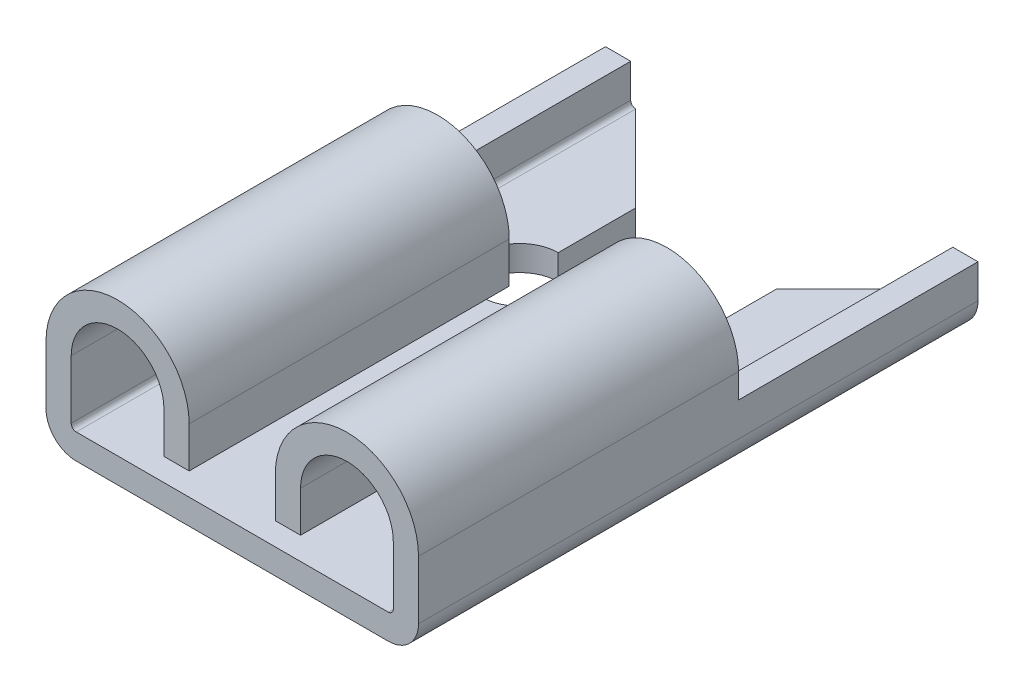
ISO-10303-21;
HEADER;
FILE_DESCRIPTION(('STEP AP214'),'2;1');
FILE_NAME('part.step','',(''),(''),'','','');
FILE_SCHEMA(('AUTOMOTIVE_DESIGN { 1 0 10303 214 1 1 1 1 }'));
ENDSEC;
DATA;
#1=APPLICATION_CONTEXT('core data for automotive mechanical design processes');
#2=APPLICATION_PROTOCOL_DEFINITION('international standard','automotive_design',2000,#1);
#3=PRODUCT_CONTEXT('',#1,'mechanical');
#4=PRODUCT('Part','Part','',(#3));
#5=PRODUCT_RELATED_PRODUCT_CATEGORY('part','',(#4));
#6=PRODUCT_DEFINITION_FORMATION('','',#4);
#7=PRODUCT_DEFINITION_CONTEXT('part definition',#1,'design');
#8=PRODUCT_DEFINITION('design','',#6,#7);
#9=PRODUCT_DEFINITION_SHAPE('','',#8);
#10=(LENGTH_UNIT() NAMED_UNIT(*) SI_UNIT(.MILLI.,.METRE.));
#11=(NAMED_UNIT(*) PLANE_ANGLE_UNIT() SI_UNIT($,.RADIAN.));
#12=(NAMED_UNIT(*) SI_UNIT($,.STERADIAN.) SOLID_ANGLE_UNIT());
#13=UNCERTAINTY_MEASURE_WITH_UNIT(LENGTH_MEASURE(1.E-05),#10,'distance_accuracy_value','');
#14=(GEOMETRIC_REPRESENTATION_CONTEXT(3) GLOBAL_UNCERTAINTY_ASSIGNED_CONTEXT((#13)) GLOBAL_UNIT_ASSIGNED_CONTEXT((#10,
#11,#12)) REPRESENTATION_CONTEXT('',''));
#15=CARTESIAN_POINT('',(0.,0.,0.));
#16=DIRECTION('',(0.,0.,1.));
#17=DIRECTION('',(1.,0.,0.));
#18=AXIS2_PLACEMENT_3D('',#15,#16,#17);
#19=CARTESIAN_POINT('',(-3.095,0.599999999999999,0.));
#20=DIRECTION('',(0.,0.,-1.));
#21=DIRECTION('',(-1.,0.,0.));
#22=AXIS2_PLACEMENT_3D('',#19,#20,#21);
#23=PLANE('',#22);
#24=DIRECTION('',(-1.,0.,0.));
#25=VECTOR('',#24,1.);
#26=CARTESIAN_POINT('',(-3.695,1.27,0.));
#27=LINE('',#26,#25);
#28=CARTESIAN_POINT('',(-3.195,1.27,0.));
#29=VERTEX_POINT('',#28);
#30=CARTESIAN_POINT('',(-3.695,1.27,0.));
#31=VERTEX_POINT('',#30);
#32=EDGE_CURVE('E472',#29,#31,#27,.T.);
#33=ORIENTED_EDGE('',*,*,#32,.F.);
#34=DIRECTION('',(0.,1.,0.));
#35=VECTOR('',#34,1.);
#36=CARTESIAN_POINT('',(-3.195,0.599999999999999,0.));
#37=LINE('',#36,#35);
#38=CARTESIAN_POINT('',(-3.195,0.599999999999999,0.));
#39=VERTEX_POINT('',#38);
#40=EDGE_CURVE('E404',#39,#29,#37,.T.);
#41=ORIENTED_EDGE('',*,*,#40,.F.);
#42=CARTESIAN_POINT('',(-3.095,0.599999999999999,0.));
#43=DIRECTION('',(0.,0.,-1.));
#44=DIRECTION('',(-1.,0.,0.));
#45=AXIS2_PLACEMENT_3D('',#42,#43,#44);
#46=CIRCLE('',#45,0.0999999999999998);
#47=CARTESIAN_POINT('',(-3.095,0.499999999999999,0.));
#48=VERTEX_POINT('',#47);
#49=EDGE_CURVE('E402',#48,#39,#46,.T.);
#50=ORIENTED_EDGE('',*,*,#49,.F.);
#51=DIRECTION('',(0.,-1.,0.));
#52=VECTOR('',#51,1.);
#53=CARTESIAN_POINT('',(-3.095,3.181,0.));
#54=LINE('',#53,#52);
#55=CARTESIAN_POINT('',(-3.095,0.,0.));
#56=VERTEX_POINT('',#55);
#57=EDGE_CURVE('E312',#48,#56,#54,.T.);
#58=ORIENTED_EDGE('',*,*,#57,.T.);
#59=CARTESIAN_POINT('',(-3.095,0.599999999999999,0.));
#60=DIRECTION('',(0.,0.,1.));
#61=DIRECTION('',(-1.,0.,0.));
#62=AXIS2_PLACEMENT_3D('',#59,#60,#61);
#63=CIRCLE('',#62,0.6);
#64=CARTESIAN_POINT('',(-3.695,0.599999999999999,0.));
#65=VERTEX_POINT('',#64);
#66=EDGE_CURVE('E337',#65,#56,#63,.T.);
#67=ORIENTED_EDGE('',*,*,#66,.F.);
#68=DIRECTION('',(0.,-1.,0.));
#69=VECTOR('',#68,1.);
#70=CARTESIAN_POINT('',(-3.695,0.599999999999999,0.));
#71=LINE('',#70,#69);
#72=EDGE_CURVE('E353',#31,#65,#71,.T.);
#73=ORIENTED_EDGE('',*,*,#72,.F.);
#74=EDGE_LOOP('',(#33,#41,#50,#58,#67,#73));
#75=FACE_BOUND('',#74,.T.);
#76=ADVANCED_FACE('F34',(#75),#23,.T.);
#77=CARTESIAN_POINT('',(-3.095,0.599999999999999,11.1));
#78=DIRECTION('',(0.,0.,-1.));
#79=DIRECTION('',(-1.,0.,0.));
#80=AXIS2_PLACEMENT_3D('',#77,#78,#79);
#81=CYLINDRICAL_SURFACE('',#80,0.6);
#82=ORIENTED_EDGE('',*,*,#66,.T.);
#83=DIRECTION('',(0.,0.,-1.));
#84=VECTOR('',#83,1.);
#85=CARTESIAN_POINT('',(-3.095,0.,11.1));
#86=LINE('',#85,#84);
#87=CARTESIAN_POINT('',(-3.095,0.,11.1));
#88=VERTEX_POINT('',#87);
#89=EDGE_CURVE('E11',#88,#56,#86,.T.);
#90=ORIENTED_EDGE('',*,*,#89,.F.);
#91=CARTESIAN_POINT('',(-3.095,0.599999999999999,11.1));
#92=DIRECTION('',(0.,0.,1.));
#93=DIRECTION('',(-1.,0.,0.));
#94=AXIS2_PLACEMENT_3D('',#91,#92,#93);
#95=CIRCLE('',#94,0.6);
#96=CARTESIAN_POINT('',(-3.695,0.599999999999999,11.1));
#97=VERTEX_POINT('',#96);
#98=EDGE_CURVE('E349',#97,#88,#95,.T.);
#99=ORIENTED_EDGE('',*,*,#98,.F.);
#100=DIRECTION('',(0.,0.,-1.));
#101=VECTOR('',#100,1.);
#102=CARTESIAN_POINT('',(-3.695,0.599999999999999,11.1));
#103=LINE('',#102,#101);
#104=EDGE_CURVE('E391',#97,#65,#103,.T.);
#105=ORIENTED_EDGE('',*,*,#104,.T.);
#106=EDGE_LOOP('',(#82,#90,#99,#105));
#107=FACE_BOUND('',#106,.T.);
#108=ADVANCED_FACE('F36',(#107),#81,.T.);
#109=CARTESIAN_POINT('',(0.,0.,11.1));
#110=DIRECTION('',(0.,1.,0.));
#111=DIRECTION('',(-1.,0.,0.));
#112=AXIS2_PLACEMENT_3D('',#109,#110,#111);
#113=PLANE('',#112);
#114=ORIENTED_EDGE('',*,*,#89,.T.);
#115=DIRECTION('',(-0.707106781186549,0.,-0.707106781186546));
#116=VECTOR('',#115,1.);
#117=CARTESIAN_POINT('',(-3.095,0.,0.));
#118=LINE('',#117,#116);
#119=CARTESIAN_POINT('',(-1.395,0.,1.69999999999999));
#120=VERTEX_POINT('',#119);
#121=EDGE_CURVE('E296',#120,#56,#118,.T.);
#122=ORIENTED_EDGE('',*,*,#121,.F.);
#123=DIRECTION('',(0.,0.,-1.));
#124=VECTOR('',#123,1.);
#125=CARTESIAN_POINT('',(-1.395,0.,1.69999999999999));
#126=LINE('',#125,#124);
#127=CARTESIAN_POINT('',(-1.395,0.,3.238));
#128=VERTEX_POINT('',#127);
#129=EDGE_CURVE('E308',#128,#120,#126,.T.);
#130=ORIENTED_EDGE('',*,*,#129,.F.);
#131=CARTESIAN_POINT('',(-1.395,0.,4.));
#132=DIRECTION('',(0.,-1.,0.));
#133=DIRECTION('',(-1.,0.,0.));
#134=AXIS2_PLACEMENT_3D('',#131,#132,#133);
#135=CIRCLE('',#134,0.761999999999999);
#136=CARTESIAN_POINT('',(-0.633000000000001,0.,4.));
#137=VERTEX_POINT('',#136);
#138=EDGE_CURVE('E324',#137,#128,#135,.T.);
#139=ORIENTED_EDGE('',*,*,#138,.F.);
#140=DIRECTION('',(-1.,0.,0.));
#141=VECTOR('',#140,1.);
#142=CARTESIAN_POINT('',(-0.633000000000001,0.,4.));
#143=LINE('',#142,#141);
#144=CARTESIAN_POINT('',(0.632999999999999,0.,4.));
#145=VERTEX_POINT('',#144);
#146=EDGE_CURVE('E327',#145,#137,#143,.T.);
#147=ORIENTED_EDGE('',*,*,#146,.F.);
#148=CARTESIAN_POINT('',(1.395,0.,4.));
#149=DIRECTION('',(0.,-1.,0.));
#150=DIRECTION('',(1.,0.,0.));
#151=AXIS2_PLACEMENT_3D('',#148,#149,#150);
#152=CIRCLE('',#151,0.761999999999999);
#153=CARTESIAN_POINT('',(1.395,0.,3.238));
#154=VERTEX_POINT('',#153);
#155=EDGE_CURVE('E317',#154,#145,#152,.T.);
#156=ORIENTED_EDGE('',*,*,#155,.F.);
#157=DIRECTION('',(0.,0.,1.));
#158=VECTOR('',#157,1.);
#159=CARTESIAN_POINT('',(1.395,0.,1.69999999999999));
#160=LINE('',#159,#158);
#161=CARTESIAN_POINT('',(1.395,0.,1.69999999999999));
#162=VERTEX_POINT('',#161);
#163=EDGE_CURVE('E314',#162,#154,#160,.T.);
#164=ORIENTED_EDGE('',*,*,#163,.F.);
#165=DIRECTION('',(-0.707106781186549,0.,0.707106781186546));
#166=VECTOR('',#165,1.);
#167=CARTESIAN_POINT('',(3.095,0.,0.));
#168=LINE('',#167,#166);
#169=CARTESIAN_POINT('',(3.095,0.,0.));
#170=VERTEX_POINT('',#169);
#171=EDGE_CURVE('E318',#170,#162,#168,.T.);
#172=ORIENTED_EDGE('',*,*,#171,.F.);
#173=DIRECTION('',(0.,0.,-1.));
#174=VECTOR('',#173,1.);
#175=CARTESIAN_POINT('',(3.095,0.,11.1));
#176=LINE('',#175,#174);
#177=CARTESIAN_POINT('',(3.095,0.,11.1));
#178=VERTEX_POINT('',#177);
#179=EDGE_CURVE('E42',#178,#170,#176,.T.);
#180=ORIENTED_EDGE('',*,*,#179,.F.);
#181=DIRECTION('',(1.,0.,0.));
#182=VECTOR('',#181,1.);
#183=CARTESIAN_POINT('',(0.,0.,11.1));
#184=LINE('',#183,#182);
#185=EDGE_CURVE('E352',#88,#178,#184,.T.);
#186=ORIENTED_EDGE('',*,*,#185,.F.);
#187=EDGE_LOOP('',(#114,#122,#130,#139,#147,#156,#164,#172,#180,#186));
#188=FACE_BOUND('',#187,.T.);
#189=ADVANCED_FACE('F525',(#188),#113,.F.);
#190=CARTESIAN_POINT('',(3.095,0.599999999999999,11.1));
#191=DIRECTION('',(0.,0.,-1.));
#192=DIRECTION('',(-1.,0.,0.));
#193=AXIS2_PLACEMENT_3D('',#190,#191,#192);
#194=CYLINDRICAL_SURFACE('',#193,0.6);
#195=CARTESIAN_POINT('',(3.095,0.599999999999999,0.));
#196=DIRECTION('',(0.,0.,1.));
#197=DIRECTION('',(1.,0.,0.));
#198=AXIS2_PLACEMENT_3D('',#195,#196,#197);
#199=CIRCLE('',#198,0.6);
#200=CARTESIAN_POINT('',(3.695,0.599999999999999,0.));
#201=VERTEX_POINT('',#200);
#202=EDGE_CURVE('E394',#170,#201,#199,.T.);
#203=ORIENTED_EDGE('',*,*,#202,.T.);
#204=DIRECTION('',(0.,0.,-1.));
#205=VECTOR('',#204,1.);
#206=CARTESIAN_POINT('',(3.695,0.599999999999999,11.1));
#207=LINE('',#206,#205);
#208=CARTESIAN_POINT('',(3.695,0.599999999999999,11.1));
#209=VERTEX_POINT('',#208);
#210=EDGE_CURVE('E457',#209,#201,#207,.T.);
#211=ORIENTED_EDGE('',*,*,#210,.F.);
#212=CARTESIAN_POINT('',(3.095,0.599999999999999,11.1));
#213=DIRECTION('',(0.,0.,1.));
#214=DIRECTION('',(1.,0.,0.));
#215=AXIS2_PLACEMENT_3D('',#212,#213,#214);
#216=CIRCLE('',#215,0.6);
#217=EDGE_CURVE('E355',#178,#209,#216,.T.);
#218=ORIENTED_EDGE('',*,*,#217,.F.);
#219=ORIENTED_EDGE('',*,*,#179,.T.);
#220=EDGE_LOOP('',(#203,#211,#218,#219));
#221=FACE_BOUND('',#220,.T.);
#222=ADVANCED_FACE('F463',(#221),#194,.T.);
#223=CARTESIAN_POINT('',(3.695,0.599999999999999,11.1));
#224=DIRECTION('',(-1.,0.,0.));
#225=DIRECTION('',(0.,-1.,0.));
#226=AXIS2_PLACEMENT_3D('',#223,#224,#225);
#227=PLANE('',#226);
#228=DIRECTION('',(0.,1.,0.));
#229=VECTOR('',#228,1.);
#230=CARTESIAN_POINT('',(3.695,0.599999999999999,0.));
#231=LINE('',#230,#229);
#232=CARTESIAN_POINT('',(3.695,1.27,0.));
#233=VERTEX_POINT('',#232);
#234=EDGE_CURVE('E253',#201,#233,#231,.T.);
#235=ORIENTED_EDGE('',*,*,#234,.T.);
#236=DIRECTION('',(0.,0.,-1.));
#237=VECTOR('',#236,1.);
#238=CARTESIAN_POINT('',(3.695,1.27,4.75));
#239=LINE('',#238,#237);
#240=CARTESIAN_POINT('',(3.695,1.27,4.75));
#241=VERTEX_POINT('',#240);
#242=EDGE_CURVE('E57',#241,#233,#239,.T.);
#243=ORIENTED_EDGE('',*,*,#242,.F.);
#244=DIRECTION('',(0.,-1.,0.));
#245=VECTOR('',#244,1.);
#246=CARTESIAN_POINT('',(3.695,3.31172477789102,4.75));
#247=LINE('',#246,#245);
#248=CARTESIAN_POINT('',(3.695,1.76,4.75));
#249=VERTEX_POINT('',#248);
#250=EDGE_CURVE('E233',#249,#241,#247,.T.);
#251=ORIENTED_EDGE('',*,*,#250,.F.);
#252=DIRECTION('',(0.,0.,-1.));
#253=VECTOR('',#252,1.);
#254=CARTESIAN_POINT('',(3.695,1.76,11.1));
#255=LINE('',#254,#253);
#256=CARTESIAN_POINT('',(3.695,1.76,11.1));
#257=VERTEX_POINT('',#256);
#258=EDGE_CURVE('E455',#257,#249,#255,.T.);
#259=ORIENTED_EDGE('',*,*,#258,.F.);
#260=DIRECTION('',(0.,1.,0.));
#261=VECTOR('',#260,1.);
#262=CARTESIAN_POINT('',(3.695,0.599999999999999,11.1));
#263=LINE('',#262,#261);
#264=EDGE_CURVE('E357',#209,#257,#263,.T.);
#265=ORIENTED_EDGE('',*,*,#264,.F.);
#266=ORIENTED_EDGE('',*,*,#210,.T.);
#267=EDGE_LOOP('',(#235,#243,#251,#259,#265,#266));
#268=FACE_BOUND('',#267,.T.);
#269=ADVANCED_FACE('F250',(#268),#227,.F.);
#270=CARTESIAN_POINT('',(2.275,1.76,11.1));
#271=DIRECTION('',(0.,0.,-1.));
#272=DIRECTION('',(-1.,0.,0.));
#273=AXIS2_PLACEMENT_3D('',#270,#271,#272);
#274=CYLINDRICAL_SURFACE('',#273,1.42);
#275=ORIENTED_EDGE('',*,*,#258,.T.);
#276=CARTESIAN_POINT('',(2.275,1.76,4.75));
#277=DIRECTION('',(0.,0.,1.));
#278=DIRECTION('',(1.,0.,0.));
#279=AXIS2_PLACEMENT_3D('',#276,#277,#278);
#280=CIRCLE('',#279,1.42);
#281=CARTESIAN_POINT('',(0.855,1.76,4.75));
#282=VERTEX_POINT('',#281);
#283=EDGE_CURVE('E238',#249,#282,#280,.T.);
#284=ORIENTED_EDGE('',*,*,#283,.T.);
#285=DIRECTION('',(0.,0.,-1.));
#286=VECTOR('',#285,1.);
#287=CARTESIAN_POINT('',(0.855,1.76,11.1));
#288=LINE('',#287,#286);
#289=CARTESIAN_POINT('',(0.855,1.76,11.1));
#290=VERTEX_POINT('',#289);
#291=EDGE_CURVE('E452',#290,#282,#288,.T.);
#292=ORIENTED_EDGE('',*,*,#291,.F.);
#293=CARTESIAN_POINT('',(2.275,1.76,11.1));
#294=DIRECTION('',(0.,0.,1.));
#295=DIRECTION('',(-1.,0.,0.));
#296=AXIS2_PLACEMENT_3D('',#293,#294,#295);
#297=CIRCLE('',#296,1.42);
#298=EDGE_CURVE('E359',#257,#290,#297,.T.);
#299=ORIENTED_EDGE('',*,*,#298,.F.);
#300=EDGE_LOOP('',(#275,#284,#292,#299));
#301=FACE_BOUND('',#300,.T.);
#302=ADVANCED_FACE('F713',(#301),#274,.T.);
#303=CARTESIAN_POINT('',(0.855,1.76,11.1));
#304=DIRECTION('',(1.,0.,0.));
#305=DIRECTION('',(0.,1.,0.));
#306=AXIS2_PLACEMENT_3D('',#303,#304,#305);
#307=PLANE('',#306);
#308=ORIENTED_EDGE('',*,*,#291,.T.);
#309=DIRECTION('',(0.,-1.,0.));
#310=VECTOR('',#309,1.);
#311=CARTESIAN_POINT('',(0.855,1.76,4.75));
#312=LINE('',#311,#310);
#313=CARTESIAN_POINT('',(0.855,0.95,4.75));
#314=VERTEX_POINT('',#313);
#315=EDGE_CURVE('E289',#282,#314,#312,.T.);
#316=ORIENTED_EDGE('',*,*,#315,.T.);
#317=DIRECTION('',(0.,0.,-1.));
#318=VECTOR('',#317,1.);
#319=CARTESIAN_POINT('',(0.855,0.95,11.1));
#320=LINE('',#319,#318);
#321=CARTESIAN_POINT('',(0.855,0.95,11.1));
#322=VERTEX_POINT('',#321);
#323=EDGE_CURVE('E449',#322,#314,#320,.T.);
#324=ORIENTED_EDGE('',*,*,#323,.F.);
#325=DIRECTION('',(0.,-1.,0.));
#326=VECTOR('',#325,1.);
#327=CARTESIAN_POINT('',(0.855,1.76,11.1));
#328=LINE('',#327,#326);
#329=EDGE_CURVE('E361',#290,#322,#328,.T.);
#330=ORIENTED_EDGE('',*,*,#329,.F.);
#331=EDGE_LOOP('',(#308,#316,#324,#330));
#332=FACE_BOUND('',#331,.T.);
#333=ADVANCED_FACE('F703',(#332),#307,.F.);
#334=CARTESIAN_POINT('',(1.355,0.95,11.1));
#335=DIRECTION('',(0.,1.,0.));
#336=DIRECTION('',(-1.,0.,0.));
#337=AXIS2_PLACEMENT_3D('',#334,#335,#336);
#338=PLANE('',#337);
#339=ORIENTED_EDGE('',*,*,#323,.T.);
#340=DIRECTION('',(1.,0.,0.));
#341=VECTOR('',#340,1.);
#342=CARTESIAN_POINT('',(1.355,0.95,4.75));
#343=LINE('',#342,#341);
#344=CARTESIAN_POINT('',(1.355,0.95,4.75));
#345=VERTEX_POINT('',#344);
#346=EDGE_CURVE('E286',#314,#345,#343,.T.);
#347=ORIENTED_EDGE('',*,*,#346,.T.);
#348=DIRECTION('',(0.,0.,-1.));
#349=VECTOR('',#348,1.);
#350=CARTESIAN_POINT('',(1.355,0.95,11.1));
#351=LINE('',#350,#349);
#352=CARTESIAN_POINT('',(1.355,0.95,11.1));
#353=VERTEX_POINT('',#352);
#354=EDGE_CURVE('E446',#353,#345,#351,.T.);
#355=ORIENTED_EDGE('',*,*,#354,.F.);
#356=DIRECTION('',(1.,0.,0.));
#357=VECTOR('',#356,1.);
#358=CARTESIAN_POINT('',(1.355,0.95,11.1));
#359=LINE('',#358,#357);
#360=EDGE_CURVE('E363',#322,#353,#359,.T.);
#361=ORIENTED_EDGE('',*,*,#360,.F.);
#362=EDGE_LOOP('',(#339,#347,#355,#361));
#363=FACE_BOUND('',#362,.T.);
#364=ADVANCED_FACE('F693',(#363),#338,.F.);
#365=CARTESIAN_POINT('',(1.355,1.76,11.1));
#366=DIRECTION('',(-1.,0.,0.));
#367=DIRECTION('',(0.,-1.,0.));
#368=AXIS2_PLACEMENT_3D('',#365,#366,#367);
#369=PLANE('',#368);
#370=ORIENTED_EDGE('',*,*,#354,.T.);
#371=DIRECTION('',(0.,1.,0.));
#372=VECTOR('',#371,1.);
#373=CARTESIAN_POINT('',(1.355,1.76,4.75));
#374=LINE('',#373,#372);
#375=CARTESIAN_POINT('',(1.355,1.76,4.75));
#376=VERTEX_POINT('',#375);
#377=EDGE_CURVE('E283',#345,#376,#374,.T.);
#378=ORIENTED_EDGE('',*,*,#377,.T.);
#379=DIRECTION('',(0.,0.,-1.));
#380=VECTOR('',#379,1.);
#381=CARTESIAN_POINT('',(1.355,1.76,11.1));
#382=LINE('',#381,#380);
#383=CARTESIAN_POINT('',(1.355,1.76,11.1));
#384=VERTEX_POINT('',#383);
#385=EDGE_CURVE('E443',#384,#376,#382,.T.);
#386=ORIENTED_EDGE('',*,*,#385,.F.);
#387=DIRECTION('',(0.,1.,0.));
#388=VECTOR('',#387,1.);
#389=CARTESIAN_POINT('',(1.355,1.76,11.1));
#390=LINE('',#389,#388);
#391=EDGE_CURVE('E365',#353,#384,#390,.T.);
#392=ORIENTED_EDGE('',*,*,#391,.F.);
#393=EDGE_LOOP('',(#370,#378,#386,#392));
#394=FACE_BOUND('',#393,.T.);
#395=ADVANCED_FACE('F683',(#394),#369,.F.);
#396=CARTESIAN_POINT('',(2.275,1.76,11.1));
#397=DIRECTION('',(0.,0.,-1.));
#398=DIRECTION('',(-1.,0.,0.));
#399=AXIS2_PLACEMENT_3D('',#396,#397,#398);
#400=CYLINDRICAL_SURFACE('',#399,0.92);
#401=ORIENTED_EDGE('',*,*,#385,.T.);
#402=CARTESIAN_POINT('',(2.275,1.76,4.75));
#403=DIRECTION('',(0.,0.,1.));
#404=DIRECTION('',(1.,0.,0.));
#405=AXIS2_PLACEMENT_3D('',#402,#403,#404);
#406=CIRCLE('',#405,0.92);
#407=CARTESIAN_POINT('',(3.195,1.76,4.75));
#408=VERTEX_POINT('',#407);
#409=EDGE_CURVE('E280',#376,#408,#406,.F.);
#410=ORIENTED_EDGE('',*,*,#409,.T.);
#411=DIRECTION('',(0.,0.,-1.));
#412=VECTOR('',#411,1.);
#413=CARTESIAN_POINT('',(3.195,1.76,11.1));
#414=LINE('',#413,#412);
#415=CARTESIAN_POINT('',(3.195,1.76,11.1));
#416=VERTEX_POINT('',#415);
#417=EDGE_CURVE('E440',#416,#408,#414,.T.);
#418=ORIENTED_EDGE('',*,*,#417,.F.);
#419=CARTESIAN_POINT('',(2.275,1.76,11.1));
#420=DIRECTION('',(0.,0.,-1.));
#421=DIRECTION('',(-1.,0.,0.));
#422=AXIS2_PLACEMENT_3D('',#419,#420,#421);
#423=CIRCLE('',#422,0.92);
#424=EDGE_CURVE('E367',#384,#416,#423,.T.);
#425=ORIENTED_EDGE('',*,*,#424,.F.);
#426=EDGE_LOOP('',(#401,#410,#418,#425));
#427=FACE_BOUND('',#426,.T.);
#428=ADVANCED_FACE('F671',(#427),#400,.F.);
#429=CARTESIAN_POINT('',(3.195,0.599999999999999,11.1));
#430=DIRECTION('',(1.,0.,0.));
#431=DIRECTION('',(0.,0.,-1.));
#432=AXIS2_PLACEMENT_3D('',#429,#430,#431);
#433=PLANE('',#432);
#434=DIRECTION('',(0.,-1.,0.));
#435=VECTOR('',#434,1.);
#436=CARTESIAN_POINT('',(3.195,0.599999999999999,4.75));
#437=LINE('',#436,#435);
#438=CARTESIAN_POINT('',(3.195,1.27,4.75));
#439=VERTEX_POINT('',#438);
#440=EDGE_CURVE('E278',#408,#439,#437,.T.);
#441=ORIENTED_EDGE('',*,*,#440,.T.);
#442=DIRECTION('',(0.,0.,-1.));
#443=VECTOR('',#442,1.);
#444=CARTESIAN_POINT('',(3.195,1.27,11.1));
#445=LINE('',#444,#443);
#446=CARTESIAN_POINT('',(3.195,1.27,0.));
#447=VERTEX_POINT('',#446);
#448=EDGE_CURVE('E246',#439,#447,#445,.T.);
#449=ORIENTED_EDGE('',*,*,#448,.T.);
#450=DIRECTION('',(0.,-1.,0.));
#451=VECTOR('',#450,1.);
#452=CARTESIAN_POINT('',(3.195,0.599999999999999,0.));
#453=LINE('',#452,#451);
#454=CARTESIAN_POINT('',(3.195,0.599999999999999,0.));
#455=VERTEX_POINT('',#454);
#456=EDGE_CURVE('E397',#447,#455,#453,.T.);
#457=ORIENTED_EDGE('',*,*,#456,.T.);
#458=DIRECTION('',(0.,0.,-1.));
#459=VECTOR('',#458,1.);
#460=CARTESIAN_POINT('',(3.195,0.599999999999999,11.1));
#461=LINE('',#460,#459);
#462=CARTESIAN_POINT('',(3.195,0.599999999999999,11.1));
#463=VERTEX_POINT('',#462);
#464=EDGE_CURVE('E437',#463,#455,#461,.T.);
#465=ORIENTED_EDGE('',*,*,#464,.F.);
#466=DIRECTION('',(0.,-1.,0.));
#467=VECTOR('',#466,1.);
#468=CARTESIAN_POINT('',(3.195,0.599999999999999,11.1));
#469=LINE('',#468,#467);
#470=EDGE_CURVE('E369',#416,#463,#469,.T.);
#471=ORIENTED_EDGE('',*,*,#470,.F.);
#472=ORIENTED_EDGE('',*,*,#417,.T.);
#473=EDGE_LOOP('',(#441,#449,#457,#465,#471,#472));
#474=FACE_BOUND('',#473,.T.);
#475=ADVANCED_FACE('F665',(#474),#433,.F.);
#476=CARTESIAN_POINT('',(3.095,0.599999999999999,11.1));
#477=DIRECTION('',(0.,0.,-1.));
#478=DIRECTION('',(-1.,0.,0.));
#479=AXIS2_PLACEMENT_3D('',#476,#477,#478);
#480=CYLINDRICAL_SURFACE('',#479,0.0999999999999998);
#481=CARTESIAN_POINT('',(3.095,0.599999999999999,0.));
#482=DIRECTION('',(0.,0.,-1.));
#483=DIRECTION('',(1.,0.,0.));
#484=AXIS2_PLACEMENT_3D('',#481,#482,#483);
#485=CIRCLE('',#484,0.0999999999999998);
#486=CARTESIAN_POINT('',(3.095,0.499999999999999,0.));
#487=VERTEX_POINT('',#486);
#488=EDGE_CURVE('E399',#455,#487,#485,.T.);
#489=ORIENTED_EDGE('',*,*,#488,.T.);
#490=DIRECTION('',(0.,0.,-1.));
#491=VECTOR('',#490,1.);
#492=CARTESIAN_POINT('',(3.095,0.499999999999999,11.1));
#493=LINE('',#492,#491);
#494=CARTESIAN_POINT('',(3.095,0.499999999999999,11.1));
#495=VERTEX_POINT('',#494);
#496=EDGE_CURVE('E434',#495,#487,#493,.T.);
#497=ORIENTED_EDGE('',*,*,#496,.F.);
#498=CARTESIAN_POINT('',(3.095,0.599999999999999,11.1));
#499=DIRECTION('',(0.,0.,-1.));
#500=DIRECTION('',(1.,0.,0.));
#501=AXIS2_PLACEMENT_3D('',#498,#499,#500);
#502=CIRCLE('',#501,0.0999999999999998);
#503=EDGE_CURVE('E371',#463,#495,#502,.T.);
#504=ORIENTED_EDGE('',*,*,#503,.F.);
#505=ORIENTED_EDGE('',*,*,#464,.T.);
#506=EDGE_LOOP('',(#489,#497,#504,#505));
#507=FACE_BOUND('',#506,.T.);
#508=ADVANCED_FACE('F670',(#507),#480,.F.);
#509=CARTESIAN_POINT('',(0.,0.5,11.1));
#510=DIRECTION('',(0.,-1.,0.));
#511=DIRECTION('',(1.,0.,0.));
#512=AXIS2_PLACEMENT_3D('',#509,#510,#511);
#513=PLANE('',#512);
#514=DIRECTION('',(0.,0.,1.));
#515=VECTOR('',#514,1.);
#516=CARTESIAN_POINT('',(-1.395,0.5,1.69999999999999));
#517=LINE('',#516,#515);
#518=CARTESIAN_POINT('',(-1.395,0.5,1.69999999999999));
#519=VERTEX_POINT('',#518);
#520=CARTESIAN_POINT('',(-1.395,0.5,3.238));
#521=VERTEX_POINT('',#520);
#522=EDGE_CURVE('E339',#519,#521,#517,.T.);
#523=ORIENTED_EDGE('',*,*,#522,.F.);
#524=DIRECTION('',(0.707106781186549,0.,0.707106781186546));
#525=VECTOR('',#524,1.);
#526=CARTESIAN_POINT('',(-3.095,0.499999999999999,0.));
#527=LINE('',#526,#525);
#528=EDGE_CURVE('E334',#48,#519,#527,.T.);
#529=ORIENTED_EDGE('',*,*,#528,.F.);
#530=DIRECTION('',(0.,0.,-1.));
#531=VECTOR('',#530,1.);
#532=CARTESIAN_POINT('',(-3.095,0.499999999999999,11.1));
#533=LINE('',#532,#531);
#534=CARTESIAN_POINT('',(-3.095,0.499999999999999,11.1));
#535=VERTEX_POINT('',#534);
#536=EDGE_CURVE('E431',#535,#48,#533,.T.);
#537=ORIENTED_EDGE('',*,*,#536,.F.);
#538=DIRECTION('',(-1.,0.,0.));
#539=VECTOR('',#538,1.);
#540=CARTESIAN_POINT('',(0.,0.5,11.1));
#541=LINE('',#540,#539);
#542=EDGE_CURVE('E373',#495,#535,#541,.T.);
#543=ORIENTED_EDGE('',*,*,#542,.F.);
#544=ORIENTED_EDGE('',*,*,#496,.T.);
#545=DIRECTION('',(0.707106781186549,0.,-0.707106781186546));
#546=VECTOR('',#545,1.);
#547=CARTESIAN_POINT('',(3.095,0.500000000000001,0.));
#548=LINE('',#547,#546);
#549=CARTESIAN_POINT('',(1.395,0.5,1.69999999999999));
#550=VERTEX_POINT('',#549);
#551=EDGE_CURVE('E332',#550,#487,#548,.T.);
#552=ORIENTED_EDGE('',*,*,#551,.F.);
#553=DIRECTION('',(0.,0.,-1.));
#554=VECTOR('',#553,1.);
#555=CARTESIAN_POINT('',(1.395,0.5,1.69999999999999));
#556=LINE('',#555,#554);
#557=CARTESIAN_POINT('',(1.395,0.5,3.238));
#558=VERTEX_POINT('',#557);
#559=EDGE_CURVE('E303',#558,#550,#556,.T.);
#560=ORIENTED_EDGE('',*,*,#559,.F.);
#561=CARTESIAN_POINT('',(1.395,0.5,4.));
#562=DIRECTION('',(0.,-1.,0.));
#563=DIRECTION('',(1.,0.,0.));
#564=AXIS2_PLACEMENT_3D('',#561,#562,#563);
#565=CIRCLE('',#564,0.761999999999999);
#566=CARTESIAN_POINT('',(0.632999999999999,0.5,4.));
#567=VERTEX_POINT('',#566);
#568=EDGE_CURVE('E299',#567,#558,#565,.F.);
#569=ORIENTED_EDGE('',*,*,#568,.F.);
#570=DIRECTION('',(1.,0.,0.));
#571=VECTOR('',#570,1.);
#572=CARTESIAN_POINT('',(-0.633,0.5,4.));
#573=LINE('',#572,#571);
#574=CARTESIAN_POINT('',(-0.633000000000001,0.5,4.));
#575=VERTEX_POINT('',#574);
#576=EDGE_CURVE('E297',#575,#567,#573,.T.);
#577=ORIENTED_EDGE('',*,*,#576,.F.);
#578=CARTESIAN_POINT('',(-1.395,0.5,4.));
#579=DIRECTION('',(0.,-1.,0.));
#580=DIRECTION('',(1.,0.,0.));
#581=AXIS2_PLACEMENT_3D('',#578,#579,#580);
#582=CIRCLE('',#581,0.761999999999999);
#583=EDGE_CURVE('E300',#521,#575,#582,.F.);
#584=ORIENTED_EDGE('',*,*,#583,.F.);
#585=EDGE_LOOP('',(#523,#529,#537,#543,#544,#552,#560,#569,#577,#584));
#586=FACE_BOUND('',#585,.T.);
#587=ADVANCED_FACE('F784',(#586),#513,.F.);
#588=CARTESIAN_POINT('',(-3.095,0.599999999999999,11.1));
#589=DIRECTION('',(0.,0.,-1.));
#590=DIRECTION('',(-1.,0.,0.));
#591=AXIS2_PLACEMENT_3D('',#588,#589,#590);
#592=CYLINDRICAL_SURFACE('',#591,0.0999999999999998);
#593=ORIENTED_EDGE('',*,*,#49,.T.);
#594=DIRECTION('',(0.,0.,-1.));
#595=VECTOR('',#594,1.);
#596=CARTESIAN_POINT('',(-3.195,0.599999999999999,11.1));
#597=LINE('',#596,#595);
#598=CARTESIAN_POINT('',(-3.195,0.599999999999999,11.1));
#599=VERTEX_POINT('',#598);
#600=EDGE_CURVE('E428',#599,#39,#597,.T.);
#601=ORIENTED_EDGE('',*,*,#600,.F.);
#602=CARTESIAN_POINT('',(-3.095,0.599999999999999,11.1));
#603=DIRECTION('',(0.,0.,-1.));
#604=DIRECTION('',(-1.,0.,0.));
#605=AXIS2_PLACEMENT_3D('',#602,#603,#604);
#606=CIRCLE('',#605,0.0999999999999998);
#607=EDGE_CURVE('E375',#535,#599,#606,.T.);
#608=ORIENTED_EDGE('',*,*,#607,.F.);
#609=ORIENTED_EDGE('',*,*,#536,.T.);
#610=EDGE_LOOP('',(#593,#601,#608,#609));
#611=FACE_BOUND('',#610,.T.);
#612=ADVANCED_FACE('F520',(#611),#592,.F.);
#613=CARTESIAN_POINT('',(-3.195,0.599999999999999,11.1));
#614=DIRECTION('',(-1.,0.,0.));
#615=DIRECTION('',(0.,0.,1.));
#616=AXIS2_PLACEMENT_3D('',#613,#614,#615);
#617=PLANE('',#616);
#618=ORIENTED_EDGE('',*,*,#40,.T.);
#619=DIRECTION('',(0.,0.,1.));
#620=VECTOR('',#619,1.);
#621=CARTESIAN_POINT('',(-3.195,1.27,11.1));
#622=LINE('',#621,#620);
#623=CARTESIAN_POINT('',(-3.195,1.27,4.75));
#624=VERTEX_POINT('',#623);
#625=EDGE_CURVE('E293',#29,#624,#622,.T.);
#626=ORIENTED_EDGE('',*,*,#625,.T.);
#627=DIRECTION('',(0.,1.,0.));
#628=VECTOR('',#627,1.);
#629=CARTESIAN_POINT('',(-3.195,0.599999999999999,4.75));
#630=LINE('',#629,#628);
#631=CARTESIAN_POINT('',(-3.195,1.76,4.75));
#632=VERTEX_POINT('',#631);
#633=EDGE_CURVE('E275',#624,#632,#630,.T.);
#634=ORIENTED_EDGE('',*,*,#633,.T.);
#635=DIRECTION('',(0.,0.,-1.));
#636=VECTOR('',#635,1.);
#637=CARTESIAN_POINT('',(-3.195,1.76,11.1));
#638=LINE('',#637,#636);
#639=CARTESIAN_POINT('',(-3.195,1.76,11.1));
#640=VERTEX_POINT('',#639);
#641=EDGE_CURVE('E425',#640,#632,#638,.T.);
#642=ORIENTED_EDGE('',*,*,#641,.F.);
#643=DIRECTION('',(0.,1.,0.));
#644=VECTOR('',#643,1.);
#645=CARTESIAN_POINT('',(-3.195,0.599999999999999,11.1));
#646=LINE('',#645,#644);
#647=EDGE_CURVE('E377',#599,#640,#646,.T.);
#648=ORIENTED_EDGE('',*,*,#647,.F.);
#649=ORIENTED_EDGE('',*,*,#600,.T.);
#650=EDGE_LOOP('',(#618,#626,#634,#642,#648,#649));
#651=FACE_BOUND('',#650,.T.);
#652=ADVANCED_FACE('F509',(#651),#617,.F.);
#653=CARTESIAN_POINT('',(-2.275,1.76,11.1));
#654=DIRECTION('',(0.,0.,-1.));
#655=DIRECTION('',(-1.,0.,0.));
#656=AXIS2_PLACEMENT_3D('',#653,#654,#655);
#657=CYLINDRICAL_SURFACE('',#656,0.92);
#658=ORIENTED_EDGE('',*,*,#641,.T.);
#659=CARTESIAN_POINT('',(-2.275,1.76,4.75));
#660=DIRECTION('',(0.,0.,1.));
#661=DIRECTION('',(1.,0.,0.));
#662=AXIS2_PLACEMENT_3D('',#659,#660,#661);
#663=CIRCLE('',#662,0.92);
#664=CARTESIAN_POINT('',(-1.355,1.76,4.75));
#665=VERTEX_POINT('',#664);
#666=EDGE_CURVE('E272',#632,#665,#663,.F.);
#667=ORIENTED_EDGE('',*,*,#666,.T.);
#668=DIRECTION('',(0.,0.,-1.));
#669=VECTOR('',#668,1.);
#670=CARTESIAN_POINT('',(-1.355,1.76,11.1));
#671=LINE('',#670,#669);
#672=CARTESIAN_POINT('',(-1.355,1.76,11.1));
#673=VERTEX_POINT('',#672);
#674=EDGE_CURVE('E422',#673,#665,#671,.T.);
#675=ORIENTED_EDGE('',*,*,#674,.F.);
#676=CARTESIAN_POINT('',(-2.275,1.76,11.1));
#677=DIRECTION('',(0.,0.,-1.));
#678=DIRECTION('',(1.,0.,0.));
#679=AXIS2_PLACEMENT_3D('',#676,#677,#678);
#680=CIRCLE('',#679,0.92);
#681=EDGE_CURVE('E379',#640,#673,#680,.T.);
#682=ORIENTED_EDGE('',*,*,#681,.F.);
#683=EDGE_LOOP('',(#658,#667,#675,#682));
#684=FACE_BOUND('',#683,.T.);
#685=ADVANCED_FACE('F504',(#684),#657,.F.);
#686=CARTESIAN_POINT('',(-1.355,1.76,11.1));
#687=DIRECTION('',(1.,0.,0.));
#688=DIRECTION('',(0.,0.,-1.));
#689=AXIS2_PLACEMENT_3D('',#686,#687,#688);
#690=PLANE('',#689);
#691=ORIENTED_EDGE('',*,*,#674,.T.);
#692=DIRECTION('',(0.,-1.,0.));
#693=VECTOR('',#692,1.);
#694=CARTESIAN_POINT('',(-1.355,1.76,4.75));
#695=LINE('',#694,#693);
#696=CARTESIAN_POINT('',(-1.355,0.95,4.75));
#697=VERTEX_POINT('',#696);
#698=EDGE_CURVE('E269',#665,#697,#695,.T.);
#699=ORIENTED_EDGE('',*,*,#698,.T.);
#700=DIRECTION('',(0.,0.,-1.));
#701=VECTOR('',#700,1.);
#702=CARTESIAN_POINT('',(-1.355,0.95,11.1));
#703=LINE('',#702,#701);
#704=CARTESIAN_POINT('',(-1.355,0.95,11.1));
#705=VERTEX_POINT('',#704);
#706=EDGE_CURVE('E419',#705,#697,#703,.T.);
#707=ORIENTED_EDGE('',*,*,#706,.F.);
#708=DIRECTION('',(0.,-1.,0.));
#709=VECTOR('',#708,1.);
#710=CARTESIAN_POINT('',(-1.355,1.76,11.1));
#711=LINE('',#710,#709);
#712=EDGE_CURVE('E381',#673,#705,#711,.T.);
#713=ORIENTED_EDGE('',*,*,#712,.F.);
#714=EDGE_LOOP('',(#691,#699,#707,#713));
#715=FACE_BOUND('',#714,.T.);
#716=ADVANCED_FACE('F501',(#715),#690,.F.);
#717=CARTESIAN_POINT('',(-1.355,0.95,11.1));
#718=DIRECTION('',(0.,1.,0.));
#719=DIRECTION('',(-1.,0.,0.));
#720=AXIS2_PLACEMENT_3D('',#717,#718,#719);
#721=PLANE('',#720);
#722=ORIENTED_EDGE('',*,*,#706,.T.);
#723=DIRECTION('',(1.,0.,0.));
#724=VECTOR('',#723,1.);
#725=CARTESIAN_POINT('',(-1.355,0.95,4.75));
#726=LINE('',#725,#724);
#727=CARTESIAN_POINT('',(-0.855,0.95,4.75));
#728=VERTEX_POINT('',#727);
#729=EDGE_CURVE('E266',#697,#728,#726,.T.);
#730=ORIENTED_EDGE('',*,*,#729,.T.);
#731=DIRECTION('',(0.,0.,-1.));
#732=VECTOR('',#731,1.);
#733=CARTESIAN_POINT('',(-0.855,0.95,11.1));
#734=LINE('',#733,#732);
#735=CARTESIAN_POINT('',(-0.855,0.95,11.1));
#736=VERTEX_POINT('',#735);
#737=EDGE_CURVE('E416',#736,#728,#734,.T.);
#738=ORIENTED_EDGE('',*,*,#737,.F.);
#739=DIRECTION('',(1.,0.,0.));
#740=VECTOR('',#739,1.);
#741=CARTESIAN_POINT('',(-1.355,0.95,11.1));
#742=LINE('',#741,#740);
#743=EDGE_CURVE('E383',#705,#736,#742,.T.);
#744=ORIENTED_EDGE('',*,*,#743,.F.);
#745=EDGE_LOOP('',(#722,#730,#738,#744));
#746=FACE_BOUND('',#745,.T.);
#747=ADVANCED_FACE('F497',(#746),#721,.F.);
#748=CARTESIAN_POINT('',(-0.855,1.76,11.1));
#749=DIRECTION('',(-1.,0.,0.));
#750=DIRECTION('',(0.,-1.,0.));
#751=AXIS2_PLACEMENT_3D('',#748,#749,#750);
#752=PLANE('',#751);
#753=ORIENTED_EDGE('',*,*,#737,.T.);
#754=DIRECTION('',(0.,1.,0.));
#755=VECTOR('',#754,1.);
#756=CARTESIAN_POINT('',(-0.855,1.76,4.75));
#757=LINE('',#756,#755);
#758=CARTESIAN_POINT('',(-0.855,1.76,4.75));
#759=VERTEX_POINT('',#758);
#760=EDGE_CURVE('E263',#728,#759,#757,.T.);
#761=ORIENTED_EDGE('',*,*,#760,.T.);
#762=DIRECTION('',(0.,0.,-1.));
#763=VECTOR('',#762,1.);
#764=CARTESIAN_POINT('',(-0.855,1.76,11.1));
#765=LINE('',#764,#763);
#766=CARTESIAN_POINT('',(-0.855,1.76,11.1));
#767=VERTEX_POINT('',#766);
#768=EDGE_CURVE('E413',#767,#759,#765,.T.);
#769=ORIENTED_EDGE('',*,*,#768,.F.);
#770=DIRECTION('',(0.,1.,0.));
#771=VECTOR('',#770,1.);
#772=CARTESIAN_POINT('',(-0.855,1.76,11.1));
#773=LINE('',#772,#771);
#774=EDGE_CURVE('E385',#736,#767,#773,.T.);
#775=ORIENTED_EDGE('',*,*,#774,.F.);
#776=EDGE_LOOP('',(#753,#761,#769,#775));
#777=FACE_BOUND('',#776,.T.);
#778=ADVANCED_FACE('F495',(#777),#752,.F.);
#779=CARTESIAN_POINT('',(-2.275,1.76,11.1));
#780=DIRECTION('',(0.,0.,-1.));
#781=DIRECTION('',(-1.,0.,0.));
#782=AXIS2_PLACEMENT_3D('',#779,#780,#781);
#783=CYLINDRICAL_SURFACE('',#782,1.42);
#784=ORIENTED_EDGE('',*,*,#768,.T.);
#785=CARTESIAN_POINT('',(-2.275,1.76,4.75));
#786=DIRECTION('',(0.,0.,1.));
#787=DIRECTION('',(1.,0.,0.));
#788=AXIS2_PLACEMENT_3D('',#785,#786,#787);
#789=CIRCLE('',#788,1.42);
#790=CARTESIAN_POINT('',(-3.695,1.76,4.75));
#791=VERTEX_POINT('',#790);
#792=EDGE_CURVE('E260',#759,#791,#789,.T.);
#793=ORIENTED_EDGE('',*,*,#792,.T.);
#794=DIRECTION('',(0.,0.,-1.));
#795=VECTOR('',#794,1.);
#796=CARTESIAN_POINT('',(-3.695,1.76,11.1));
#797=LINE('',#796,#795);
#798=CARTESIAN_POINT('',(-3.695,1.76,11.1));
#799=VERTEX_POINT('',#798);
#800=EDGE_CURVE('E410',#799,#791,#797,.T.);
#801=ORIENTED_EDGE('',*,*,#800,.F.);
#802=CARTESIAN_POINT('',(-2.275,1.76,11.1));
#803=DIRECTION('',(0.,0.,1.));
#804=DIRECTION('',(1.,0.,0.));
#805=AXIS2_PLACEMENT_3D('',#802,#803,#804);
#806=CIRCLE('',#805,1.42);
#807=EDGE_CURVE('E387',#767,#799,#806,.T.);
#808=ORIENTED_EDGE('',*,*,#807,.F.);
#809=EDGE_LOOP('',(#784,#793,#801,#808));
#810=FACE_BOUND('',#809,.T.);
#811=ADVANCED_FACE('F481',(#810),#783,.T.);
#812=CARTESIAN_POINT('',(-3.695,0.599999999999999,11.1));
#813=DIRECTION('',(1.,0.,0.));
#814=DIRECTION('',(0.,1.,0.));
#815=AXIS2_PLACEMENT_3D('',#812,#813,#814);
#816=PLANE('',#815);
#817=DIRECTION('',(0.,1.,0.));
#818=VECTOR('',#817,1.);
#819=CARTESIAN_POINT('',(-3.695,3.31172477789102,4.75));
#820=LINE('',#819,#818);
#821=CARTESIAN_POINT('',(-3.695,1.27,4.75));
#822=VERTEX_POINT('',#821);
#823=EDGE_CURVE('E242',#822,#791,#820,.T.);
#824=ORIENTED_EDGE('',*,*,#823,.F.);
#825=DIRECTION('',(0.,0.,-1.));
#826=VECTOR('',#825,1.);
#827=CARTESIAN_POINT('',(-3.695,1.27,4.75));
#828=LINE('',#827,#826);
#829=EDGE_CURVE('E49',#822,#31,#828,.T.);
#830=ORIENTED_EDGE('',*,*,#829,.T.);
#831=ORIENTED_EDGE('',*,*,#72,.T.);
#832=ORIENTED_EDGE('',*,*,#104,.F.);
#833=DIRECTION('',(0.,-1.,0.));
#834=VECTOR('',#833,1.);
#835=CARTESIAN_POINT('',(-3.695,0.599999999999999,11.1));
#836=LINE('',#835,#834);
#837=EDGE_CURVE('E389',#799,#97,#836,.T.);
#838=ORIENTED_EDGE('',*,*,#837,.F.);
#839=ORIENTED_EDGE('',*,*,#800,.T.);
#840=EDGE_LOOP('',(#824,#830,#831,#832,#838,#839));
#841=FACE_BOUND('',#840,.T.);
#842=ADVANCED_FACE('F485',(#841),#816,.F.);
#843=CARTESIAN_POINT('',(-3.095,0.599999999999999,11.1));
#844=DIRECTION('',(0.,0.,-1.));
#845=DIRECTION('',(-1.,0.,0.));
#846=AXIS2_PLACEMENT_3D('',#843,#844,#845);
#847=PLANE('',#846);
#848=ORIENTED_EDGE('',*,*,#98,.T.);
#849=ORIENTED_EDGE('',*,*,#185,.T.);
#850=ORIENTED_EDGE('',*,*,#217,.T.);
#851=ORIENTED_EDGE('',*,*,#264,.T.);
#852=ORIENTED_EDGE('',*,*,#298,.T.);
#853=ORIENTED_EDGE('',*,*,#329,.T.);
#854=ORIENTED_EDGE('',*,*,#360,.T.);
#855=ORIENTED_EDGE('',*,*,#391,.T.);
#856=ORIENTED_EDGE('',*,*,#424,.T.);
#857=ORIENTED_EDGE('',*,*,#470,.T.);
#858=ORIENTED_EDGE('',*,*,#503,.T.);
#859=ORIENTED_EDGE('',*,*,#542,.T.);
#860=ORIENTED_EDGE('',*,*,#607,.T.);
#861=ORIENTED_EDGE('',*,*,#647,.T.);
#862=ORIENTED_EDGE('',*,*,#681,.T.);
#863=ORIENTED_EDGE('',*,*,#712,.T.);
#864=ORIENTED_EDGE('',*,*,#743,.T.);
#865=ORIENTED_EDGE('',*,*,#774,.T.);
#866=ORIENTED_EDGE('',*,*,#807,.T.);
#867=ORIENTED_EDGE('',*,*,#837,.T.);
#868=EDGE_LOOP('',(#848,#849,#850,#851,#852,#853,#854,#855,#856,#857,#858,#859,#860,#861,#862,
#863,#864,#865,#866,#867));
#869=FACE_BOUND('',#868,.T.);
#870=ADVANCED_FACE('F489',(#869),#847,.F.);
#871=DIRECTION('',(-1.,0.,0.));
#872=VECTOR('',#871,1.);
#873=CARTESIAN_POINT('',(2.941,1.27,0.));
#874=LINE('',#873,#872);
#875=EDGE_CURVE('E471',#233,#447,#874,.T.);
#876=ORIENTED_EDGE('',*,*,#875,.F.);
#877=ORIENTED_EDGE('',*,*,#234,.F.);
#878=ORIENTED_EDGE('',*,*,#202,.F.);
#879=DIRECTION('',(0.,1.,0.));
#880=VECTOR('',#879,1.);
#881=CARTESIAN_POINT('',(3.095,3.181,0.));
#882=LINE('',#881,#880);
#883=EDGE_CURVE('E311',#170,#487,#882,.T.);
#884=ORIENTED_EDGE('',*,*,#883,.T.);
#885=ORIENTED_EDGE('',*,*,#488,.F.);
#886=ORIENTED_EDGE('',*,*,#456,.F.);
#887=EDGE_LOOP('',(#876,#877,#878,#884,#885,#886));
#888=FACE_BOUND('',#887,.T.);
#889=ADVANCED_FACE('F468',(#888),#23,.T.);
#890=CARTESIAN_POINT('',(-0.633000000000001,3.181,4.));
#891=DIRECTION('',(0.,0.,1.));
#892=DIRECTION('',(1.,0.,0.));
#893=AXIS2_PLACEMENT_3D('',#890,#891,#892);
#894=PLANE('',#893);
#895=ORIENTED_EDGE('',*,*,#576,.T.);
#896=DIRECTION('',(0.,-1.,0.));
#897=VECTOR('',#896,1.);
#898=CARTESIAN_POINT('',(0.632999999999999,3.181,4.));
#899=LINE('',#898,#897);
#900=EDGE_CURVE('E301',#567,#145,#899,.T.);
#901=ORIENTED_EDGE('',*,*,#900,.T.);
#902=ORIENTED_EDGE('',*,*,#146,.T.);
#903=DIRECTION('',(0.,-1.,0.));
#904=VECTOR('',#903,1.);
#905=CARTESIAN_POINT('',(-0.633000000000001,3.181,4.));
#906=LINE('',#905,#904);
#907=EDGE_CURVE('E305',#575,#137,#906,.T.);
#908=ORIENTED_EDGE('',*,*,#907,.F.);
#909=EDGE_LOOP('',(#895,#901,#902,#908));
#910=FACE_BOUND('',#909,.T.);
#911=ADVANCED_FACE('F539',(#910),#894,.F.);
#912=CARTESIAN_POINT('',(-1.395,3.181,4.));
#913=DIRECTION('',(0.,-1.,0.));
#914=DIRECTION('',(1.,0.,0.));
#915=AXIS2_PLACEMENT_3D('',#912,#913,#914);
#916=CYLINDRICAL_SURFACE('',#915,0.761999999999999);
#917=ORIENTED_EDGE('',*,*,#583,.T.);
#918=ORIENTED_EDGE('',*,*,#907,.T.);
#919=ORIENTED_EDGE('',*,*,#138,.T.);
#920=DIRECTION('',(0.,-1.,0.));
#921=VECTOR('',#920,1.);
#922=CARTESIAN_POINT('',(-1.395,3.181,3.238));
#923=LINE('',#922,#921);
#924=EDGE_CURVE('E307',#521,#128,#923,.T.);
#925=ORIENTED_EDGE('',*,*,#924,.F.);
#926=EDGE_LOOP('',(#917,#918,#919,#925));
#927=FACE_BOUND('',#926,.T.);
#928=ADVANCED_FACE('F544',(#927),#916,.F.);
#929=CARTESIAN_POINT('',(-1.395,3.181,1.69999999999999));
#930=DIRECTION('',(-1.,0.,0.));
#931=DIRECTION('',(0.,0.,1.));
#932=AXIS2_PLACEMENT_3D('',#929,#930,#931);
#933=PLANE('',#932);
#934=ORIENTED_EDGE('',*,*,#522,.T.);
#935=ORIENTED_EDGE('',*,*,#924,.T.);
#936=ORIENTED_EDGE('',*,*,#129,.T.);
#937=DIRECTION('',(0.,-1.,0.));
#938=VECTOR('',#937,1.);
#939=CARTESIAN_POINT('',(-1.395,3.181,1.69999999999999));
#940=LINE('',#939,#938);
#941=EDGE_CURVE('E342',#519,#120,#940,.T.);
#942=ORIENTED_EDGE('',*,*,#941,.F.);
#943=EDGE_LOOP('',(#934,#935,#936,#942));
#944=FACE_BOUND('',#943,.T.);
#945=ADVANCED_FACE('F566',(#944),#933,.F.);
#946=CARTESIAN_POINT('',(-3.095,3.181,0.));
#947=DIRECTION('',(-0.707106781186546,0.,0.707106781186549));
#948=DIRECTION('',(0.707106781186549,0.,0.707106781186546));
#949=AXIS2_PLACEMENT_3D('',#946,#947,#948);
#950=PLANE('',#949);
#951=ORIENTED_EDGE('',*,*,#528,.T.);
#952=ORIENTED_EDGE('',*,*,#941,.T.);
#953=ORIENTED_EDGE('',*,*,#121,.T.);
#954=ORIENTED_EDGE('',*,*,#57,.F.);
#955=EDGE_LOOP('',(#951,#952,#953,#954));
#956=FACE_BOUND('',#955,.T.);
#957=ADVANCED_FACE('F562',(#956),#950,.F.);
#958=CARTESIAN_POINT('',(3.095,3.181,0.));
#959=DIRECTION('',(0.707106781186546,0.,0.707106781186549));
#960=DIRECTION('',(0.707106781186549,0.,-0.707106781186546));
#961=AXIS2_PLACEMENT_3D('',#958,#959,#960);
#962=PLANE('',#961);
#963=ORIENTED_EDGE('',*,*,#551,.T.);
#964=ORIENTED_EDGE('',*,*,#883,.F.);
#965=ORIENTED_EDGE('',*,*,#171,.T.);
#966=DIRECTION('',(0.,-1.,0.));
#967=VECTOR('',#966,1.);
#968=CARTESIAN_POINT('',(1.395,3.181,1.69999999999999));
#969=LINE('',#968,#967);
#970=EDGE_CURVE('E309',#550,#162,#969,.T.);
#971=ORIENTED_EDGE('',*,*,#970,.F.);
#972=EDGE_LOOP('',(#963,#964,#965,#971));
#973=FACE_BOUND('',#972,.T.);
#974=ADVANCED_FACE('F558',(#973),#962,.F.);
#975=CARTESIAN_POINT('',(1.395,3.181,1.69999999999999));
#976=DIRECTION('',(1.,0.,0.));
#977=DIRECTION('',(0.,0.,-1.));
#978=AXIS2_PLACEMENT_3D('',#975,#976,#977);
#979=PLANE('',#978);
#980=ORIENTED_EDGE('',*,*,#559,.T.);
#981=ORIENTED_EDGE('',*,*,#970,.T.);
#982=ORIENTED_EDGE('',*,*,#163,.T.);
#983=DIRECTION('',(0.,-1.,0.));
#984=VECTOR('',#983,1.);
#985=CARTESIAN_POINT('',(1.395,3.181,3.238));
#986=LINE('',#985,#984);
#987=EDGE_CURVE('E304',#558,#154,#986,.T.);
#988=ORIENTED_EDGE('',*,*,#987,.F.);
#989=EDGE_LOOP('',(#980,#981,#982,#988));
#990=FACE_BOUND('',#989,.T.);
#991=ADVANCED_FACE('F554',(#990),#979,.F.);
#992=CARTESIAN_POINT('',(1.395,3.181,4.));
#993=DIRECTION('',(0.,-1.,0.));
#994=DIRECTION('',(1.,0.,0.));
#995=AXIS2_PLACEMENT_3D('',#992,#993,#994);
#996=CYLINDRICAL_SURFACE('',#995,0.761999999999999);
#997=ORIENTED_EDGE('',*,*,#568,.T.);
#998=ORIENTED_EDGE('',*,*,#987,.T.);
#999=ORIENTED_EDGE('',*,*,#155,.T.);
#1000=ORIENTED_EDGE('',*,*,#900,.F.);
#1001=EDGE_LOOP('',(#997,#998,#999,#1000));
#1002=FACE_BOUND('',#1001,.T.);
#1003=ADVANCED_FACE('F551',(#1002),#996,.F.);
#1004=CARTESIAN_POINT('',(2.941,1.27,4.75));
#1005=DIRECTION('',(0.,-1.,0.));
#1006=DIRECTION('',(0.,0.,-1.));
#1007=AXIS2_PLACEMENT_3D('',#1004,#1005,#1006);
#1008=PLANE('',#1007);
#1009=DIRECTION('',(-1.,0.,0.));
#1010=VECTOR('',#1009,1.);
#1011=CARTESIAN_POINT('',(2.941,1.27,4.75));
#1012=LINE('',#1011,#1010);
#1013=EDGE_CURVE('E235',#241,#439,#1012,.T.);
#1014=ORIENTED_EDGE('',*,*,#1013,.F.);
#1015=ORIENTED_EDGE('',*,*,#242,.T.);
#1016=ORIENTED_EDGE('',*,*,#875,.T.);
#1017=ORIENTED_EDGE('',*,*,#448,.F.);
#1018=EDGE_LOOP('',(#1014,#1015,#1016,#1017));
#1019=FACE_BOUND('',#1018,.T.);
#1020=ADVANCED_FACE('F244',(#1019),#1008,.F.);
#1021=CARTESIAN_POINT('',(0.,0.,4.75));
#1022=DIRECTION('',(0.,0.,1.));
#1023=DIRECTION('',(1.,0.,0.));
#1024=AXIS2_PLACEMENT_3D('',#1021,#1022,#1023);
#1025=PLANE('',#1024);
#1026=ORIENTED_EDGE('',*,*,#250,.T.);
#1027=ORIENTED_EDGE('',*,*,#1013,.T.);
#1028=ORIENTED_EDGE('',*,*,#440,.F.);
#1029=ORIENTED_EDGE('',*,*,#409,.F.);
#1030=ORIENTED_EDGE('',*,*,#377,.F.);
#1031=ORIENTED_EDGE('',*,*,#346,.F.);
#1032=ORIENTED_EDGE('',*,*,#315,.F.);
#1033=ORIENTED_EDGE('',*,*,#283,.F.);
#1034=EDGE_LOOP('',(#1026,#1027,#1028,#1029,#1030,#1031,#1032,#1033));
#1035=FACE_BOUND('',#1034,.T.);
#1036=ADVANCED_FACE('F234',(#1035),#1025,.F.);
#1037=CARTESIAN_POINT('',(-3.695,1.27,4.75));
#1038=DIRECTION('',(0.,-1.,0.));
#1039=DIRECTION('',(1.,0.,0.));
#1040=AXIS2_PLACEMENT_3D('',#1037,#1038,#1039);
#1041=PLANE('',#1040);
#1042=ORIENTED_EDGE('',*,*,#32,.T.);
#1043=ORIENTED_EDGE('',*,*,#829,.F.);
#1044=DIRECTION('',(-1.,0.,0.));
#1045=VECTOR('',#1044,1.);
#1046=CARTESIAN_POINT('',(-3.695,1.27,4.75));
#1047=LINE('',#1046,#1045);
#1048=EDGE_CURVE('E247',#624,#822,#1047,.T.);
#1049=ORIENTED_EDGE('',*,*,#1048,.F.);
#1050=ORIENTED_EDGE('',*,*,#625,.F.);
#1051=EDGE_LOOP('',(#1042,#1043,#1049,#1050));
#1052=FACE_BOUND('',#1051,.T.);
#1053=ADVANCED_FACE('F510',(#1052),#1041,.F.);
#1054=ORIENTED_EDGE('',*,*,#1048,.T.);
#1055=ORIENTED_EDGE('',*,*,#823,.T.);
#1056=ORIENTED_EDGE('',*,*,#792,.F.);
#1057=ORIENTED_EDGE('',*,*,#760,.F.);
#1058=ORIENTED_EDGE('',*,*,#729,.F.);
#1059=ORIENTED_EDGE('',*,*,#698,.F.);
#1060=ORIENTED_EDGE('',*,*,#666,.F.);
#1061=ORIENTED_EDGE('',*,*,#633,.F.);
#1062=EDGE_LOOP('',(#1054,#1055,#1056,#1057,#1058,#1059,#1060,#1061));
#1063=FACE_BOUND('',#1062,.T.);
#1064=ADVANCED_FACE('F477',(#1063),#1025,.F.);
#1065=CLOSED_SHELL('',(#76,#108,#189,#222,#269,#302,#333,#364,#395,#428,#475,#508,#587,#612,
#652,#685,#716,#747,#778,#811,#842,#870,#889,#911,#928,#945,#957,#974,#991,#1003,#1020,#1036,
#1053,#1064));
#1066=MANIFOLD_SOLID_BREP('B2',#1065);
#1067=ADVANCED_BREP_SHAPE_REPRESENTATION('',(#18,#1066),#14);
#1068=SHAPE_DEFINITION_REPRESENTATION(#9,#1067);
ENDSEC;
END-ISO-10303-21;
